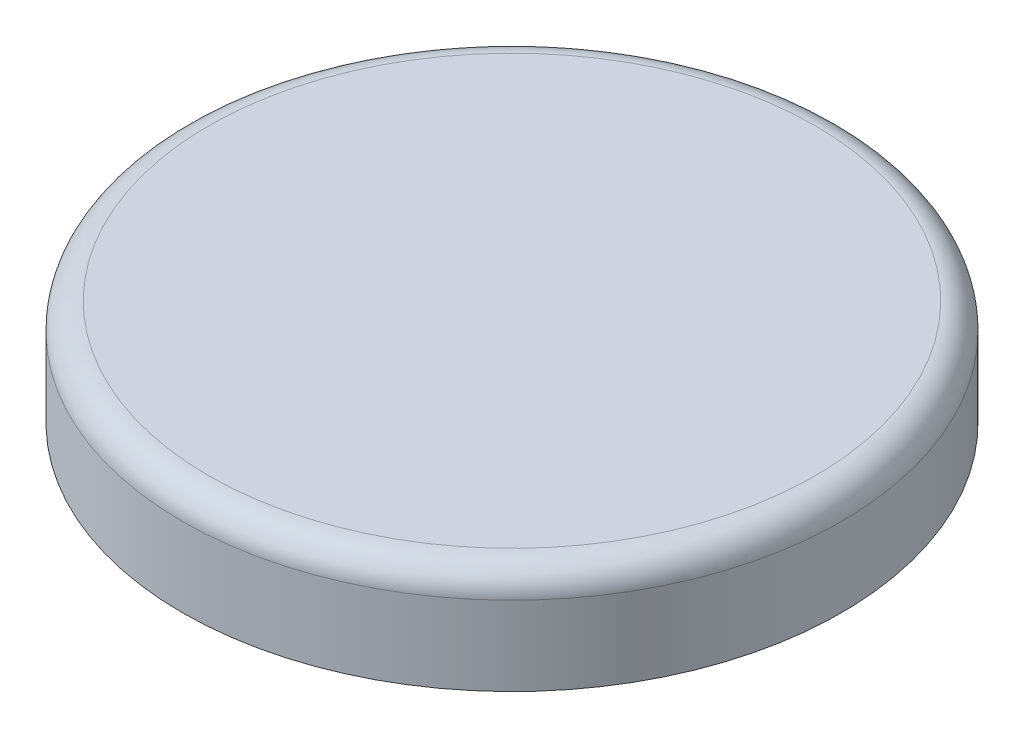
ISO-10303-21;
HEADER;
FILE_DESCRIPTION(('STEP AP214'),'2;1');
FILE_NAME('part.step','',(''),(''),'','','');
FILE_SCHEMA(('AUTOMOTIVE_DESIGN { 1 0 10303 214 1 1 1 1 }'));
ENDSEC;
DATA;
#1=APPLICATION_CONTEXT('core data for automotive mechanical design processes');
#2=APPLICATION_PROTOCOL_DEFINITION('international standard','automotive_design',2000,#1);
#3=PRODUCT_CONTEXT('',#1,'mechanical');
#4=PRODUCT('Part','Part','',(#3));
#5=PRODUCT_RELATED_PRODUCT_CATEGORY('part','',(#4));
#6=PRODUCT_DEFINITION_FORMATION('','',#4);
#7=PRODUCT_DEFINITION_CONTEXT('part definition',#1,'design');
#8=PRODUCT_DEFINITION('design','',#6,#7);
#9=PRODUCT_DEFINITION_SHAPE('','',#8);
#10=(LENGTH_UNIT() NAMED_UNIT(*) SI_UNIT(.MILLI.,.METRE.));
#11=(NAMED_UNIT(*) PLANE_ANGLE_UNIT() SI_UNIT($,.RADIAN.));
#12=(NAMED_UNIT(*) SI_UNIT($,.STERADIAN.) SOLID_ANGLE_UNIT());
#13=UNCERTAINTY_MEASURE_WITH_UNIT(LENGTH_MEASURE(1.E-05),#10,'distance_accuracy_value','');
#14=(GEOMETRIC_REPRESENTATION_CONTEXT(3) GLOBAL_UNCERTAINTY_ASSIGNED_CONTEXT((#13)) GLOBAL_UNIT_ASSIGNED_CONTEXT((#10,
#11,#12)) REPRESENTATION_CONTEXT('',''));
#15=CARTESIAN_POINT('',(0.,0.,0.));
#16=DIRECTION('',(0.,0.,1.));
#17=DIRECTION('',(1.,0.,0.));
#18=AXIS2_PLACEMENT_3D('',#15,#16,#17);
#19=CARTESIAN_POINT('',(0.,40.,0.));
#20=DIRECTION('',(0.,-1.,0.));
#21=DIRECTION('',(0.,0.,-1.));
#22=AXIS2_PLACEMENT_3D('',#19,#20,#21);
#23=CYLINDRICAL_SURFACE('',#22,125.);
#24=CARTESIAN_POINT('',(0.,30.,0.));
#25=DIRECTION('',(0.,1.,0.));
#26=DIRECTION('',(0.,0.,1.));
#27=AXIS2_PLACEMENT_3D('',#24,#25,#26);
#28=CIRCLE('',#27,125.);
#29=CARTESIAN_POINT('',(0.,30.,125.));
#30=VERTEX_POINT('',#29);
#31=EDGE_CURVE('E10',#30,#30,#28,.F.);
#32=ORIENTED_EDGE('',*,*,#31,.T.);
#33=EDGE_LOOP('',(#32));
#34=FACE_BOUND('',#33,.T.);
#35=CARTESIAN_POINT('',(0.,0.,0.));
#36=DIRECTION('',(0.,1.,0.));
#37=DIRECTION('',(0.,0.,1.));
#38=AXIS2_PLACEMENT_3D('',#35,#36,#37);
#39=CIRCLE('',#38,125.);
#40=CARTESIAN_POINT('',(0.,0.,125.));
#41=VERTEX_POINT('',#40);
#42=EDGE_CURVE('E41',#41,#41,#39,.T.);
#43=ORIENTED_EDGE('',*,*,#42,.T.);
#44=EDGE_LOOP('',(#43));
#45=FACE_BOUND('',#44,.T.);
#46=ADVANCED_FACE('F30',(#34,#45),#23,.T.);
#47=CARTESIAN_POINT('',(0.,40.,0.));
#48=DIRECTION('',(0.,1.,0.));
#49=DIRECTION('',(0.,0.,1.));
#50=AXIS2_PLACEMENT_3D('',#47,#48,#49);
#51=PLANE('',#50);
#52=CARTESIAN_POINT('',(0.,40.,0.));
#53=DIRECTION('',(0.,1.,0.));
#54=DIRECTION('',(0.,0.,1.));
#55=AXIS2_PLACEMENT_3D('',#52,#53,#54);
#56=CIRCLE('',#55,115.);
#57=CARTESIAN_POINT('',(0.,40.,115.));
#58=VERTEX_POINT('',#57);
#59=EDGE_CURVE('E37',#58,#58,#56,.T.);
#60=ORIENTED_EDGE('',*,*,#59,.T.);
#61=EDGE_LOOP('',(#60));
#62=FACE_BOUND('',#61,.T.);
#63=ADVANCED_FACE('F65',(#62),#51,.T.);
#64=CARTESIAN_POINT('',(0.,0.,0.));
#65=DIRECTION('',(0.,1.,0.));
#66=DIRECTION('',(0.,0.,1.));
#67=AXIS2_PLACEMENT_3D('',#64,#65,#66);
#68=PLANE('',#67);
#69=CARTESIAN_POINT('',(0.,0.,0.));
#70=DIRECTION('',(0.,-1.,0.));
#71=DIRECTION('',(0.,0.,-1.));
#72=AXIS2_PLACEMENT_3D('',#69,#70,#71);
#73=CIRCLE('',#72,100.);
#74=CARTESIAN_POINT('',(0.,0.,-100.));
#75=VERTEX_POINT('',#74);
#76=EDGE_CURVE('E48',#75,#75,#73,.T.);
#77=ORIENTED_EDGE('',*,*,#76,.F.);
#78=EDGE_LOOP('',(#77));
#79=FACE_BOUND('',#78,.T.);
#80=ORIENTED_EDGE('',*,*,#42,.F.);
#81=EDGE_LOOP('',(#80));
#82=FACE_BOUND('',#81,.T.);
#83=ADVANCED_FACE('F59',(#79,#82),#68,.F.);
#84=CARTESIAN_POINT('',(0.,30.,0.));
#85=DIRECTION('',(0.,-1.,0.));
#86=DIRECTION('',(0.,0.,-1.));
#87=AXIS2_PLACEMENT_3D('',#84,#85,#86);
#88=CYLINDRICAL_SURFACE('',#87,100.);
#89=CARTESIAN_POINT('',(0.,30.,0.));
#90=DIRECTION('',(0.,-1.,0.));
#91=DIRECTION('',(0.,0.,-1.));
#92=AXIS2_PLACEMENT_3D('',#89,#90,#91);
#93=CIRCLE('',#92,100.);
#94=CARTESIAN_POINT('',(0.,30.,-100.));
#95=VERTEX_POINT('',#94);
#96=EDGE_CURVE('E45',#95,#95,#93,.T.);
#97=ORIENTED_EDGE('',*,*,#96,.F.);
#98=EDGE_LOOP('',(#97));
#99=FACE_BOUND('',#98,.T.);
#100=ORIENTED_EDGE('',*,*,#76,.T.);
#101=EDGE_LOOP('',(#100));
#102=FACE_BOUND('',#101,.T.);
#103=ADVANCED_FACE('F56',(#99,#102),#88,.F.);
#104=CARTESIAN_POINT('',(0.,30.,0.));
#105=DIRECTION('',(0.,-1.,0.));
#106=DIRECTION('',(0.,0.,-1.));
#107=AXIS2_PLACEMENT_3D('',#104,#105,#106);
#108=PLANE('',#107);
#109=ORIENTED_EDGE('',*,*,#96,.T.);
#110=EDGE_LOOP('',(#109));
#111=FACE_BOUND('',#110,.T.);
#112=ADVANCED_FACE('F54',(#111),#108,.T.);
#113=CARTESIAN_POINT('',(0.,30.,0.));
#114=DIRECTION('',(0.,1.,0.));
#115=DIRECTION('',(0.,0.,1.));
#116=AXIS2_PLACEMENT_3D('',#113,#114,#115);
#117=TOROIDAL_SURFACE('',#116,115.,10.);
#118=ORIENTED_EDGE('',*,*,#31,.F.);
#119=EDGE_LOOP('',(#118));
#120=FACE_BOUND('',#119,.T.);
#121=ORIENTED_EDGE('',*,*,#59,.F.);
#122=EDGE_LOOP('',(#121));
#123=FACE_BOUND('',#122,.T.);
#124=ADVANCED_FACE('F32',(#120,#123),#117,.T.);
#125=CLOSED_SHELL('',(#46,#63,#83,#103,#112,#124));
#126=MANIFOLD_SOLID_BREP('B2',#125);
#127=ADVANCED_BREP_SHAPE_REPRESENTATION('',(#18,#126),#14);
#128=SHAPE_DEFINITION_REPRESENTATION(#9,#127);
ENDSEC;
END-ISO-10303-21;
